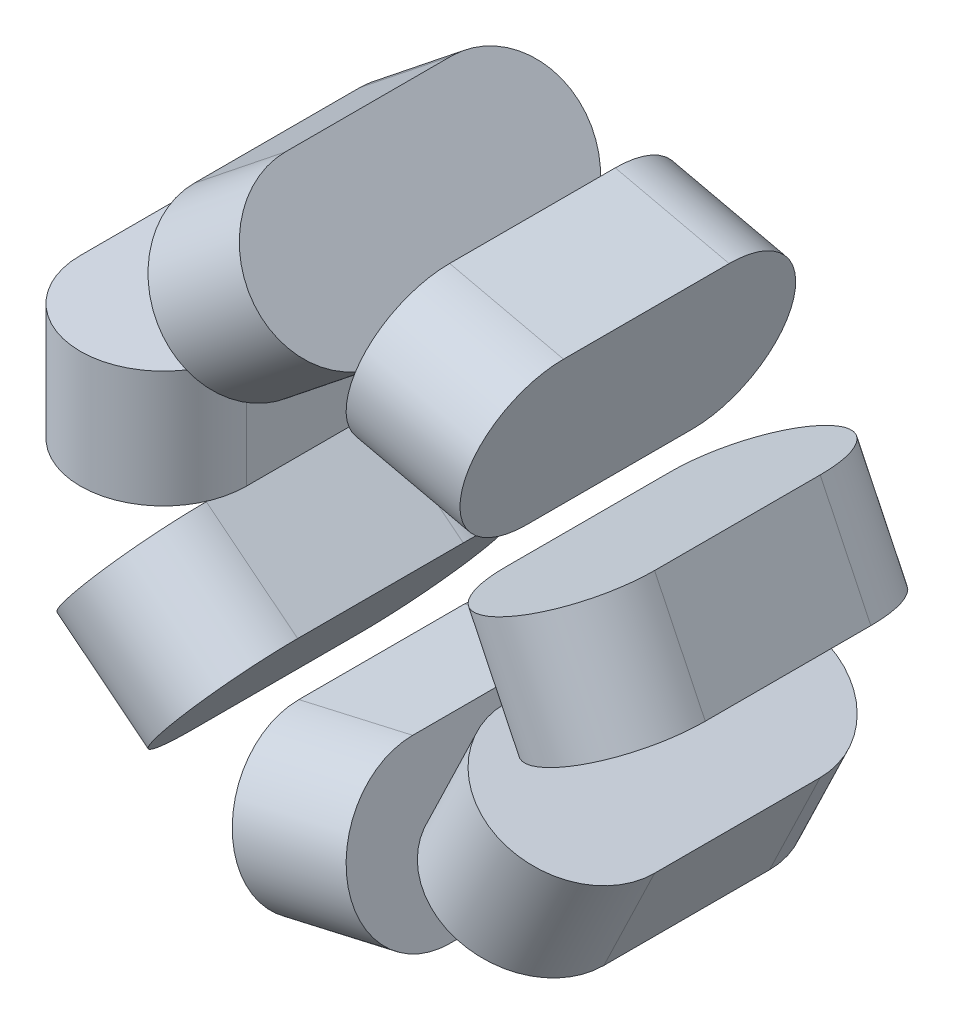
ISO-10303-21;
HEADER;
FILE_DESCRIPTION(('STEP AP214'),'2;1');
FILE_NAME('part.step','',(''),(''),'','','');
FILE_SCHEMA(('AUTOMOTIVE_DESIGN { 1 0 10303 214 1 1 1 1 }'));
ENDSEC;
DATA;
#1=APPLICATION_CONTEXT('core data for automotive mechanical design processes');
#2=APPLICATION_PROTOCOL_DEFINITION('international standard','automotive_design',2000,#1);
#3=PRODUCT_CONTEXT('',#1,'mechanical');
#4=PRODUCT('Part','Part','',(#3));
#5=PRODUCT_RELATED_PRODUCT_CATEGORY('part','',(#4));
#6=PRODUCT_DEFINITION_FORMATION('','',#4);
#7=PRODUCT_DEFINITION_CONTEXT('part definition',#1,'design');
#8=PRODUCT_DEFINITION('design','',#6,#7);
#9=PRODUCT_DEFINITION_SHAPE('','',#8);
#10=(LENGTH_UNIT() NAMED_UNIT(*) SI_UNIT(.MILLI.,.METRE.));
#11=(NAMED_UNIT(*) PLANE_ANGLE_UNIT() SI_UNIT($,.RADIAN.));
#12=(NAMED_UNIT(*) SI_UNIT($,.STERADIAN.) SOLID_ANGLE_UNIT());
#13=UNCERTAINTY_MEASURE_WITH_UNIT(LENGTH_MEASURE(1.E-05),#10,'distance_accuracy_value','');
#14=(GEOMETRIC_REPRESENTATION_CONTEXT(3) GLOBAL_UNCERTAINTY_ASSIGNED_CONTEXT((#13)) GLOBAL_UNIT_ASSIGNED_CONTEXT((#10,
#11,#12)) REPRESENTATION_CONTEXT('',''));
#15=CARTESIAN_POINT('',(0.,0.,0.));
#16=DIRECTION('',(0.,0.,1.));
#17=DIRECTION('',(1.,0.,0.));
#18=AXIS2_PLACEMENT_3D('',#15,#16,#17);
#19=CARTESIAN_POINT('',(503.512842884967,-221.403130222077,852.44114971681));
#20=DIRECTION('',(0.781831482468022,-0.623489801858743,0.));
#21=DIRECTION('',(0.,0.,-1.));
#22=AXIS2_PLACEMENT_3D('',#19,#20,#21);
#23=CYLINDRICAL_SURFACE('',#22,186.757711363559);
#24=CARTESIAN_POINT('',(708.849936114439,-385.15399782305,852.44114971681));
#25=DIRECTION('',(-0.781831482468022,0.623489801858743,0.));
#26=DIRECTION('',(0.,0.,1.));
#27=AXIS2_PLACEMENT_3D('',#24,#25,#26);
#28=CIRCLE('',#27,186.757711363559);
#29=CARTESIAN_POINT('',(825.291464568097,-239.140939485343,852.44114971681));
#30=VERTEX_POINT('',#29);
#31=CARTESIAN_POINT('',(592.408407660781,-531.167056160756,852.44114971681));
#32=VERTEX_POINT('',#31);
#33=EDGE_CURVE('E108',#30,#32,#28,.T.);
#34=ORIENTED_EDGE('',*,*,#33,.T.);
#35=DIRECTION('',(0.781831482468022,-0.623489801858743,0.));
#36=VECTOR('',#35,1.);
#37=CARTESIAN_POINT('',(387.071314431309,-367.416188559783,852.44114971681));
#38=LINE('',#37,#36);
#39=CARTESIAN_POINT('',(387.071314431309,-367.416188559783,852.44114971681));
#40=VERTEX_POINT('',#39);
#41=EDGE_CURVE('E12',#40,#32,#38,.T.);
#42=ORIENTED_EDGE('',*,*,#41,.F.);
#43=CARTESIAN_POINT('',(503.512842884967,-221.403130222077,852.44114971681));
#44=DIRECTION('',(-0.781831482468022,0.623489801858743,0.));
#45=DIRECTION('',(0.,0.,1.));
#46=AXIS2_PLACEMENT_3D('',#43,#44,#45);
#47=CIRCLE('',#46,186.757711363559);
#48=CARTESIAN_POINT('',(619.954371338625,-75.3900718843703,852.44114971681));
#49=VERTEX_POINT('',#48);
#50=EDGE_CURVE('E96',#49,#40,#47,.T.);
#51=ORIENTED_EDGE('',*,*,#50,.F.);
#52=DIRECTION('',(0.781831482468022,-0.623489801858743,0.));
#53=VECTOR('',#52,1.);
#54=CARTESIAN_POINT('',(619.954371338625,-75.3900718843703,852.44114971681));
#55=LINE('',#54,#53);
#56=EDGE_CURVE('E104',#49,#30,#55,.T.);
#57=ORIENTED_EDGE('',*,*,#56,.T.);
#58=EDGE_LOOP('',(#34,#42,#51,#57));
#59=FACE_BOUND('',#58,.T.);
#60=ADVANCED_FACE('F45',(#59),#23,.T.);
#61=CARTESIAN_POINT('',(387.071314431309,-367.416188559783,852.44114971681));
#62=DIRECTION('',(0.623489801858743,0.781831482468022,0.));
#63=DIRECTION('',(0.,0.,-1.));
#64=AXIS2_PLACEMENT_3D('',#61,#62,#63);
#65=PLANE('',#64);
#66=DIRECTION('',(0.,0.,1.));
#67=VECTOR('',#66,1.);
#68=CARTESIAN_POINT('',(592.408407660781,-531.167056160756,852.44114971681));
#69=LINE('',#68,#67);
#70=CARTESIAN_POINT('',(592.408407660781,-531.167056160756,1224.89070806245));
#71=VERTEX_POINT('',#70);
#72=EDGE_CURVE('E100',#32,#71,#69,.T.);
#73=ORIENTED_EDGE('',*,*,#72,.T.);
#74=DIRECTION('',(0.781831482468022,-0.623489801858743,0.));
#75=VECTOR('',#74,1.);
#76=CARTESIAN_POINT('',(387.071314431309,-367.416188559783,1224.89070806245));
#77=LINE('',#76,#75);
#78=CARTESIAN_POINT('',(387.071314431309,-367.416188559783,1224.89070806245));
#79=VERTEX_POINT('',#78);
#80=EDGE_CURVE('E53',#79,#71,#77,.T.);
#81=ORIENTED_EDGE('',*,*,#80,.F.);
#82=DIRECTION('',(0.,0.,1.));
#83=VECTOR('',#82,1.);
#84=CARTESIAN_POINT('',(387.071314431309,-367.416188559783,852.44114971681));
#85=LINE('',#84,#83);
#86=EDGE_CURVE('E91',#40,#79,#85,.T.);
#87=ORIENTED_EDGE('',*,*,#86,.F.);
#88=ORIENTED_EDGE('',*,*,#41,.T.);
#89=EDGE_LOOP('',(#73,#81,#87,#88));
#90=FACE_BOUND('',#89,.T.);
#91=ADVANCED_FACE('F99',(#90),#65,.F.);
#92=CARTESIAN_POINT('',(503.512842884967,-221.403130222077,1224.89070806245));
#93=DIRECTION('',(0.781831482468022,-0.623489801858743,0.));
#94=DIRECTION('',(0.,0.,-1.));
#95=AXIS2_PLACEMENT_3D('',#92,#93,#94);
#96=CYLINDRICAL_SURFACE('',#95,186.757711363559);
#97=CARTESIAN_POINT('',(708.849936114439,-385.15399782305,1224.89070806245));
#98=DIRECTION('',(-0.781831482468022,0.623489801858743,0.));
#99=DIRECTION('',(0.,0.,1.));
#100=AXIS2_PLACEMENT_3D('',#97,#98,#99);
#101=CIRCLE('',#100,186.757711363559);
#102=CARTESIAN_POINT('',(825.291464568097,-239.140939485343,1224.89070806245));
#103=VERTEX_POINT('',#102);
#104=EDGE_CURVE('E78',#71,#103,#101,.T.);
#105=ORIENTED_EDGE('',*,*,#104,.T.);
#106=DIRECTION('',(0.781831482468022,-0.623489801858743,0.));
#107=VECTOR('',#106,1.);
#108=CARTESIAN_POINT('',(619.954371338625,-75.3900718843703,1224.89070806245));
#109=LINE('',#108,#107);
#110=CARTESIAN_POINT('',(619.954371338625,-75.3900718843703,1224.89070806245));
#111=VERTEX_POINT('',#110);
#112=EDGE_CURVE('E101',#111,#103,#109,.T.);
#113=ORIENTED_EDGE('',*,*,#112,.F.);
#114=CARTESIAN_POINT('',(503.512842884967,-221.403130222077,1224.89070806245));
#115=DIRECTION('',(-0.781831482468022,0.623489801858743,0.));
#116=DIRECTION('',(0.,0.,1.));
#117=AXIS2_PLACEMENT_3D('',#114,#115,#116);
#118=CIRCLE('',#117,186.757711363559);
#119=EDGE_CURVE('E94',#79,#111,#118,.T.);
#120=ORIENTED_EDGE('',*,*,#119,.F.);
#121=ORIENTED_EDGE('',*,*,#80,.T.);
#122=EDGE_LOOP('',(#105,#113,#120,#121));
#123=FACE_BOUND('',#122,.T.);
#124=ADVANCED_FACE('F102',(#123),#96,.T.);
#125=CARTESIAN_POINT('',(619.954371338625,-75.3900718843703,852.44114971681));
#126=DIRECTION('',(-0.623489801858743,-0.781831482468022,0.));
#127=DIRECTION('',(0.,0.,1.));
#128=AXIS2_PLACEMENT_3D('',#125,#126,#127);
#129=PLANE('',#128);
#130=DIRECTION('',(0.,0.,-1.));
#131=VECTOR('',#130,1.);
#132=CARTESIAN_POINT('',(825.291464568097,-239.140939485343,852.44114971681));
#133=LINE('',#132,#131);
#134=EDGE_CURVE('E84',#103,#30,#133,.T.);
#135=ORIENTED_EDGE('',*,*,#134,.T.);
#136=ORIENTED_EDGE('',*,*,#56,.F.);
#137=DIRECTION('',(0.,0.,-1.));
#138=VECTOR('',#137,1.);
#139=CARTESIAN_POINT('',(619.954371338625,-75.3900718843703,852.44114971681));
#140=LINE('',#139,#138);
#141=EDGE_CURVE('E61',#111,#49,#140,.T.);
#142=ORIENTED_EDGE('',*,*,#141,.F.);
#143=ORIENTED_EDGE('',*,*,#112,.T.);
#144=EDGE_LOOP('',(#135,#136,#142,#143));
#145=FACE_BOUND('',#144,.T.);
#146=ADVANCED_FACE('F115',(#145),#129,.F.);
#147=CARTESIAN_POINT('',(503.512842884967,-221.403130222077,852.44114971681));
#148=DIRECTION('',(-0.781831482468022,0.623489801858743,0.));
#149=DIRECTION('',(0.,0.,1.));
#150=AXIS2_PLACEMENT_3D('',#147,#148,#149);
#151=PLANE('',#150);
#152=ORIENTED_EDGE('',*,*,#50,.T.);
#153=ORIENTED_EDGE('',*,*,#86,.T.);
#154=ORIENTED_EDGE('',*,*,#119,.T.);
#155=ORIENTED_EDGE('',*,*,#141,.T.);
#156=EDGE_LOOP('',(#152,#153,#154,#155));
#157=FACE_BOUND('',#156,.T.);
#158=ADVANCED_FACE('F92',(#157),#151,.T.);
#159=CARTESIAN_POINT('',(708.849936114439,-385.15399782305,852.44114971681));
#160=DIRECTION('',(-0.781831482468022,0.623489801858743,0.));
#161=DIRECTION('',(0.,0.,1.));
#162=AXIS2_PLACEMENT_3D('',#159,#160,#161);
#163=PLANE('',#162);
#164=ORIENTED_EDGE('',*,*,#33,.F.);
#165=ORIENTED_EDGE('',*,*,#134,.F.);
#166=ORIENTED_EDGE('',*,*,#104,.F.);
#167=ORIENTED_EDGE('',*,*,#72,.F.);
#168=EDGE_LOOP('',(#164,#165,#166,#167));
#169=FACE_BOUND('',#168,.T.);
#170=ADVANCED_FACE('F118',(#169),#163,.F.);
#171=CLOSED_SHELL('',(#60,#91,#124,#146,#158,#170));
#172=MANIFOLD_SOLID_BREP('B2',#171);
#173=CARTESIAN_POINT('',(869.569421479793,-538.721187586139,852.44114971681));
#174=DIRECTION('',(0.974927912181826,0.222520933956305,0.));
#175=DIRECTION('',(0.,0.,-1.));
#176=AXIS2_PLACEMENT_3D('',#173,#174,#175);
#177=CYLINDRICAL_SURFACE('',#176,186.757711363559);
#178=CARTESIAN_POINT('',(1125.62058862358,-480.279179575591,852.44114971681));
#179=DIRECTION('',(-0.974927912181826,-0.222520933956305,0.));
#180=DIRECTION('',(0.,0.,1.));
#181=AXIS2_PLACEMENT_3D('',#178,#179,#180);
#182=CIRCLE('',#181,186.757711363559);
#183=CARTESIAN_POINT('',(1084.06308826742,-298.20387395206,852.44114971681));
#184=VERTEX_POINT('',#183);
#185=CARTESIAN_POINT('',(1167.17808897974,-662.354485199121,852.44114971681));
#186=VERTEX_POINT('',#185);
#187=EDGE_CURVE('E241',#184,#186,#182,.T.);
#188=ORIENTED_EDGE('',*,*,#187,.T.);
#189=DIRECTION('',(0.974927912181826,0.222520933956305,0.));
#190=VECTOR('',#189,1.);
#191=CARTESIAN_POINT('',(911.126921835954,-720.796493209669,852.44114971681));
#192=LINE('',#191,#190);
#193=CARTESIAN_POINT('',(911.126921835954,-720.796493209669,852.44114971681));
#194=VERTEX_POINT('',#193);
#195=EDGE_CURVE('E43',#194,#186,#192,.T.);
#196=ORIENTED_EDGE('',*,*,#195,.F.);
#197=CARTESIAN_POINT('',(869.569421479793,-538.721187586139,852.44114971681));
#198=DIRECTION('',(-0.974927912181826,-0.222520933956305,0.));
#199=DIRECTION('',(0.,0.,1.));
#200=AXIS2_PLACEMENT_3D('',#197,#198,#199);
#201=CIRCLE('',#200,186.757711363559);
#202=CARTESIAN_POINT('',(828.011921123631,-356.645881962608,852.44114971681));
#203=VERTEX_POINT('',#202);
#204=EDGE_CURVE('E229',#203,#194,#201,.T.);
#205=ORIENTED_EDGE('',*,*,#204,.F.);
#206=DIRECTION('',(0.974927912181826,0.222520933956305,0.));
#207=VECTOR('',#206,1.);
#208=CARTESIAN_POINT('',(828.011921123631,-356.645881962608,852.44114971681));
#209=LINE('',#208,#207);
#210=EDGE_CURVE('E237',#203,#184,#209,.T.);
#211=ORIENTED_EDGE('',*,*,#210,.T.);
#212=EDGE_LOOP('',(#188,#196,#205,#211));
#213=FACE_BOUND('',#212,.T.);
#214=ADVANCED_FACE('F178',(#213),#177,.T.);
#215=CARTESIAN_POINT('',(911.126921835954,-720.796493209669,852.44114971681));
#216=DIRECTION('',(-0.222520933956305,0.974927912181826,0.));
#217=DIRECTION('',(0.,0.,-1.));
#218=AXIS2_PLACEMENT_3D('',#215,#216,#217);
#219=PLANE('',#218);
#220=DIRECTION('',(0.,0.,1.));
#221=VECTOR('',#220,1.);
#222=CARTESIAN_POINT('',(1167.17808897974,-662.354485199121,852.44114971681));
#223=LINE('',#222,#221);
#224=CARTESIAN_POINT('',(1167.17808897974,-662.354485199121,1224.89070806245));
#225=VERTEX_POINT('',#224);
#226=EDGE_CURVE('E233',#186,#225,#223,.T.);
#227=ORIENTED_EDGE('',*,*,#226,.T.);
#228=DIRECTION('',(0.974927912181826,0.222520933956305,0.));
#229=VECTOR('',#228,1.);
#230=CARTESIAN_POINT('',(911.126921835954,-720.796493209669,1224.89070806245));
#231=LINE('',#230,#229);
#232=CARTESIAN_POINT('',(911.126921835954,-720.796493209669,1224.89070806245));
#233=VERTEX_POINT('',#232);
#234=EDGE_CURVE('E186',#233,#225,#231,.T.);
#235=ORIENTED_EDGE('',*,*,#234,.F.);
#236=DIRECTION('',(0.,0.,1.));
#237=VECTOR('',#236,1.);
#238=CARTESIAN_POINT('',(911.126921835954,-720.796493209669,852.44114971681));
#239=LINE('',#238,#237);
#240=EDGE_CURVE('E224',#194,#233,#239,.T.);
#241=ORIENTED_EDGE('',*,*,#240,.F.);
#242=ORIENTED_EDGE('',*,*,#195,.T.);
#243=EDGE_LOOP('',(#227,#235,#241,#242));
#244=FACE_BOUND('',#243,.T.);
#245=ADVANCED_FACE('F232',(#244),#219,.F.);
#246=CARTESIAN_POINT('',(869.569421479793,-538.721187586139,1224.89070806245));
#247=DIRECTION('',(0.974927912181826,0.222520933956305,0.));
#248=DIRECTION('',(0.,0.,-1.));
#249=AXIS2_PLACEMENT_3D('',#246,#247,#248);
#250=CYLINDRICAL_SURFACE('',#249,186.757711363559);
#251=CARTESIAN_POINT('',(1125.62058862358,-480.279179575591,1224.89070806245));
#252=DIRECTION('',(-0.974927912181826,-0.222520933956305,0.));
#253=DIRECTION('',(0.,0.,1.));
#254=AXIS2_PLACEMENT_3D('',#251,#252,#253);
#255=CIRCLE('',#254,186.757711363559);
#256=CARTESIAN_POINT('',(1084.06308826742,-298.20387395206,1224.89070806245));
#257=VERTEX_POINT('',#256);
#258=EDGE_CURVE('E211',#225,#257,#255,.T.);
#259=ORIENTED_EDGE('',*,*,#258,.T.);
#260=DIRECTION('',(0.974927912181826,0.222520933956305,0.));
#261=VECTOR('',#260,1.);
#262=CARTESIAN_POINT('',(828.011921123631,-356.645881962608,1224.89070806245));
#263=LINE('',#262,#261);
#264=CARTESIAN_POINT('',(828.011921123631,-356.645881962608,1224.89070806245));
#265=VERTEX_POINT('',#264);
#266=EDGE_CURVE('E234',#265,#257,#263,.T.);
#267=ORIENTED_EDGE('',*,*,#266,.F.);
#268=CARTESIAN_POINT('',(869.569421479793,-538.721187586139,1224.89070806245));
#269=DIRECTION('',(-0.974927912181826,-0.222520933956305,0.));
#270=DIRECTION('',(0.,0.,1.));
#271=AXIS2_PLACEMENT_3D('',#268,#269,#270);
#272=CIRCLE('',#271,186.757711363559);
#273=EDGE_CURVE('E227',#233,#265,#272,.T.);
#274=ORIENTED_EDGE('',*,*,#273,.F.);
#275=ORIENTED_EDGE('',*,*,#234,.T.);
#276=EDGE_LOOP('',(#259,#267,#274,#275));
#277=FACE_BOUND('',#276,.T.);
#278=ADVANCED_FACE('F235',(#277),#250,.T.);
#279=CARTESIAN_POINT('',(828.011921123631,-356.645881962608,852.44114971681));
#280=DIRECTION('',(0.222520933956305,-0.974927912181826,0.));
#281=DIRECTION('',(0.,0.,1.));
#282=AXIS2_PLACEMENT_3D('',#279,#280,#281);
#283=PLANE('',#282);
#284=DIRECTION('',(0.,0.,-1.));
#285=VECTOR('',#284,1.);
#286=CARTESIAN_POINT('',(1084.06308826742,-298.20387395206,852.44114971681));
#287=LINE('',#286,#285);
#288=EDGE_CURVE('E217',#257,#184,#287,.T.);
#289=ORIENTED_EDGE('',*,*,#288,.T.);
#290=ORIENTED_EDGE('',*,*,#210,.F.);
#291=DIRECTION('',(0.,0.,-1.));
#292=VECTOR('',#291,1.);
#293=CARTESIAN_POINT('',(828.011921123631,-356.645881962608,852.44114971681));
#294=LINE('',#293,#292);
#295=EDGE_CURVE('E194',#265,#203,#294,.T.);
#296=ORIENTED_EDGE('',*,*,#295,.F.);
#297=ORIENTED_EDGE('',*,*,#266,.T.);
#298=EDGE_LOOP('',(#289,#290,#296,#297));
#299=FACE_BOUND('',#298,.T.);
#300=ADVANCED_FACE('F248',(#299),#283,.F.);
#301=CARTESIAN_POINT('',(869.569421479793,-538.721187586139,852.44114971681));
#302=DIRECTION('',(-0.974927912181826,-0.222520933956305,0.));
#303=DIRECTION('',(0.,0.,1.));
#304=AXIS2_PLACEMENT_3D('',#301,#302,#303);
#305=PLANE('',#304);
#306=ORIENTED_EDGE('',*,*,#204,.T.);
#307=ORIENTED_EDGE('',*,*,#240,.T.);
#308=ORIENTED_EDGE('',*,*,#273,.T.);
#309=ORIENTED_EDGE('',*,*,#295,.T.);
#310=EDGE_LOOP('',(#306,#307,#308,#309));
#311=FACE_BOUND('',#310,.T.);
#312=ADVANCED_FACE('F225',(#311),#305,.T.);
#313=CARTESIAN_POINT('',(1125.62058862358,-480.279179575591,852.44114971681));
#314=DIRECTION('',(-0.974927912181826,-0.222520933956305,0.));
#315=DIRECTION('',(0.,0.,1.));
#316=AXIS2_PLACEMENT_3D('',#313,#314,#315);
#317=PLANE('',#316);
#318=ORIENTED_EDGE('',*,*,#187,.F.);
#319=ORIENTED_EDGE('',*,*,#288,.F.);
#320=ORIENTED_EDGE('',*,*,#258,.F.);
#321=ORIENTED_EDGE('',*,*,#226,.F.);
#322=EDGE_LOOP('',(#318,#319,#320,#321));
#323=FACE_BOUND('',#322,.T.);
#324=ADVANCED_FACE('F251',(#323),#317,.F.);
#325=CLOSED_SHELL('',(#214,#245,#278,#300,#312,#324));
#326=MANIFOLD_SOLID_BREP('B6',#325);
#327=CARTESIAN_POINT('',(1345.89121233979,-450.371202788288,852.44114971681));
#328=DIRECTION('',(0.433883739117565,0.900968867902416,0.));
#329=DIRECTION('',(0.,0.,-1.));
#330=AXIS2_PLACEMENT_3D('',#327,#328,#329);
#331=CYLINDRICAL_SURFACE('',#330,186.757711363559);
#332=CARTESIAN_POINT('',(1459.84470204667,-213.744343197869,852.44114971681));
#333=DIRECTION('',(-0.433883739117565,-0.900968867902416,0.));
#334=DIRECTION('',(0.,0.,1.));
#335=AXIS2_PLACEMENT_3D('',#332,#333,#334);
#336=CIRCLE('',#335,186.757711363559);
#337=CARTESIAN_POINT('',(1291.58181826739,-132.713209082409,852.44114971681));
#338=VERTEX_POINT('',#337);
#339=CARTESIAN_POINT('',(1628.10758582594,-294.775477313329,852.44114971681));
#340=VERTEX_POINT('',#339);
#341=EDGE_CURVE('E374',#338,#340,#336,.T.);
#342=ORIENTED_EDGE('',*,*,#341,.T.);
#343=DIRECTION('',(0.433883739117565,0.900968867902416,0.));
#344=VECTOR('',#343,1.);
#345=CARTESIAN_POINT('',(1514.15409611906,-531.402336903748,852.44114971681));
#346=LINE('',#345,#344);
#347=CARTESIAN_POINT('',(1514.15409611906,-531.402336903748,852.44114971681));
#348=VERTEX_POINT('',#347);
#349=EDGE_CURVE('E176',#348,#340,#346,.T.);
#350=ORIENTED_EDGE('',*,*,#349,.F.);
#351=CARTESIAN_POINT('',(1345.89121233979,-450.371202788288,852.44114971681));
#352=DIRECTION('',(-0.433883739117565,-0.900968867902416,0.));
#353=DIRECTION('',(0.,0.,1.));
#354=AXIS2_PLACEMENT_3D('',#351,#352,#353);
#355=CIRCLE('',#354,186.757711363559);
#356=CARTESIAN_POINT('',(1177.62832856051,-369.340068672828,852.44114971681));
#357=VERTEX_POINT('',#356);
#358=EDGE_CURVE('E362',#357,#348,#355,.T.);
#359=ORIENTED_EDGE('',*,*,#358,.F.);
#360=DIRECTION('',(0.433883739117565,0.900968867902416,0.));
#361=VECTOR('',#360,1.);
#362=CARTESIAN_POINT('',(1177.62832856051,-369.340068672828,852.44114971681));
#363=LINE('',#362,#361);
#364=EDGE_CURVE('E370',#357,#338,#363,.T.);
#365=ORIENTED_EDGE('',*,*,#364,.T.);
#366=EDGE_LOOP('',(#342,#350,#359,#365));
#367=FACE_BOUND('',#366,.T.);
#368=ADVANCED_FACE('F311',(#367),#331,.T.);
#369=CARTESIAN_POINT('',(1514.15409611906,-531.402336903748,852.44114971681));
#370=DIRECTION('',(-0.900968867902416,0.433883739117565,0.));
#371=DIRECTION('',(0.,0.,-1.));
#372=AXIS2_PLACEMENT_3D('',#369,#370,#371);
#373=PLANE('',#372);
#374=DIRECTION('',(0.,0.,1.));
#375=VECTOR('',#374,1.);
#376=CARTESIAN_POINT('',(1628.10758582594,-294.775477313329,852.44114971681));
#377=LINE('',#376,#375);
#378=CARTESIAN_POINT('',(1628.10758582594,-294.775477313329,1224.89070806245));
#379=VERTEX_POINT('',#378);
#380=EDGE_CURVE('E366',#340,#379,#377,.T.);
#381=ORIENTED_EDGE('',*,*,#380,.T.);
#382=DIRECTION('',(0.433883739117565,0.900968867902416,0.));
#383=VECTOR('',#382,1.);
#384=CARTESIAN_POINT('',(1514.15409611906,-531.402336903748,1224.89070806245));
#385=LINE('',#384,#383);
#386=CARTESIAN_POINT('',(1514.15409611906,-531.402336903748,1224.89070806245));
#387=VERTEX_POINT('',#386);
#388=EDGE_CURVE('E319',#387,#379,#385,.T.);
#389=ORIENTED_EDGE('',*,*,#388,.F.);
#390=DIRECTION('',(0.,0.,1.));
#391=VECTOR('',#390,1.);
#392=CARTESIAN_POINT('',(1514.15409611906,-531.402336903748,852.44114971681));
#393=LINE('',#392,#391);
#394=EDGE_CURVE('E357',#348,#387,#393,.T.);
#395=ORIENTED_EDGE('',*,*,#394,.F.);
#396=ORIENTED_EDGE('',*,*,#349,.T.);
#397=EDGE_LOOP('',(#381,#389,#395,#396));
#398=FACE_BOUND('',#397,.T.);
#399=ADVANCED_FACE('F365',(#398),#373,.F.);
#400=CARTESIAN_POINT('',(1345.89121233979,-450.371202788288,1224.89070806245));
#401=DIRECTION('',(0.433883739117565,0.900968867902416,0.));
#402=DIRECTION('',(0.,0.,-1.));
#403=AXIS2_PLACEMENT_3D('',#400,#401,#402);
#404=CYLINDRICAL_SURFACE('',#403,186.757711363559);
#405=CARTESIAN_POINT('',(1459.84470204667,-213.744343197869,1224.89070806245));
#406=DIRECTION('',(-0.433883739117565,-0.900968867902416,0.));
#407=DIRECTION('',(0.,0.,1.));
#408=AXIS2_PLACEMENT_3D('',#405,#406,#407);
#409=CIRCLE('',#408,186.757711363559);
#410=CARTESIAN_POINT('',(1291.58181826739,-132.713209082409,1224.89070806245));
#411=VERTEX_POINT('',#410);
#412=EDGE_CURVE('E344',#379,#411,#409,.T.);
#413=ORIENTED_EDGE('',*,*,#412,.T.);
#414=DIRECTION('',(0.433883739117565,0.900968867902416,0.));
#415=VECTOR('',#414,1.);
#416=CARTESIAN_POINT('',(1177.62832856051,-369.340068672828,1224.89070806245));
#417=LINE('',#416,#415);
#418=CARTESIAN_POINT('',(1177.62832856051,-369.340068672828,1224.89070806245));
#419=VERTEX_POINT('',#418);
#420=EDGE_CURVE('E367',#419,#411,#417,.T.);
#421=ORIENTED_EDGE('',*,*,#420,.F.);
#422=CARTESIAN_POINT('',(1345.89121233979,-450.371202788288,1224.89070806245));
#423=DIRECTION('',(-0.433883739117565,-0.900968867902416,0.));
#424=DIRECTION('',(0.,0.,1.));
#425=AXIS2_PLACEMENT_3D('',#422,#423,#424);
#426=CIRCLE('',#425,186.757711363559);
#427=EDGE_CURVE('E360',#387,#419,#426,.T.);
#428=ORIENTED_EDGE('',*,*,#427,.F.);
#429=ORIENTED_EDGE('',*,*,#388,.T.);
#430=EDGE_LOOP('',(#413,#421,#428,#429));
#431=FACE_BOUND('',#430,.T.);
#432=ADVANCED_FACE('F368',(#431),#404,.T.);
#433=CARTESIAN_POINT('',(1177.62832856051,-369.340068672828,852.44114971681));
#434=DIRECTION('',(0.900968867902416,-0.433883739117565,0.));
#435=DIRECTION('',(0.,0.,1.));
#436=AXIS2_PLACEMENT_3D('',#433,#434,#435);
#437=PLANE('',#436);
#438=DIRECTION('',(0.,0.,-1.));
#439=VECTOR('',#438,1.);
#440=CARTESIAN_POINT('',(1291.58181826739,-132.713209082409,852.44114971681));
#441=LINE('',#440,#439);
#442=EDGE_CURVE('E350',#411,#338,#441,.T.);
#443=ORIENTED_EDGE('',*,*,#442,.T.);
#444=ORIENTED_EDGE('',*,*,#364,.F.);
#445=DIRECTION('',(0.,0.,-1.));
#446=VECTOR('',#445,1.);
#447=CARTESIAN_POINT('',(1177.62832856051,-369.340068672828,852.44114971681));
#448=LINE('',#447,#446);
#449=EDGE_CURVE('E327',#419,#357,#448,.T.);
#450=ORIENTED_EDGE('',*,*,#449,.F.);
#451=ORIENTED_EDGE('',*,*,#420,.T.);
#452=EDGE_LOOP('',(#443,#444,#450,#451));
#453=FACE_BOUND('',#452,.T.);
#454=ADVANCED_FACE('F381',(#453),#437,.F.);
#455=CARTESIAN_POINT('',(1345.89121233979,-450.371202788288,852.44114971681));
#456=DIRECTION('',(-0.433883739117565,-0.900968867902416,0.));
#457=DIRECTION('',(0.,0.,1.));
#458=AXIS2_PLACEMENT_3D('',#455,#456,#457);
#459=PLANE('',#458);
#460=ORIENTED_EDGE('',*,*,#358,.T.);
#461=ORIENTED_EDGE('',*,*,#394,.T.);
#462=ORIENTED_EDGE('',*,*,#427,.T.);
#463=ORIENTED_EDGE('',*,*,#449,.T.);
#464=EDGE_LOOP('',(#460,#461,#462,#463));
#465=FACE_BOUND('',#464,.T.);
#466=ADVANCED_FACE('F358',(#465),#459,.T.);
#467=CARTESIAN_POINT('',(1459.84470204667,-213.744343197869,852.44114971681));
#468=DIRECTION('',(-0.433883739117565,-0.900968867902416,0.));
#469=DIRECTION('',(0.,0.,1.));
#470=AXIS2_PLACEMENT_3D('',#467,#468,#469);
#471=PLANE('',#470);
#472=ORIENTED_EDGE('',*,*,#341,.F.);
#473=ORIENTED_EDGE('',*,*,#442,.F.);
#474=ORIENTED_EDGE('',*,*,#412,.F.);
#475=ORIENTED_EDGE('',*,*,#380,.F.);
#476=EDGE_LOOP('',(#472,#473,#474,#475));
#477=FACE_BOUND('',#476,.T.);
#478=ADVANCED_FACE('F384',(#477),#471,.F.);
#479=CLOSED_SHELL('',(#368,#399,#432,#454,#466,#478));
#480=MANIFOLD_SOLID_BREP('B37',#479);
#481=CARTESIAN_POINT('',(1573.79819175355,-22.8825163925579,852.44114971681));
#482=DIRECTION('',(-0.433883739117553,0.900968867902422,0.));
#483=DIRECTION('',(0.,0.,-1.));
#484=AXIS2_PLACEMENT_3D('',#481,#482,#483);
#485=CYLINDRICAL_SURFACE('',#484,186.757711363559);
#486=CARTESIAN_POINT('',(1459.84470204667,213.744343197863,852.44114971681));
#487=DIRECTION('',(0.433883739117553,-0.900968867902422,0.));
#488=DIRECTION('',(0.,0.,1.));
#489=AXIS2_PLACEMENT_3D('',#486,#487,#488);
#490=CIRCLE('',#489,186.757711363559);
#491=CARTESIAN_POINT('',(1291.5818182674,132.713209082405,852.44114971681));
#492=VERTEX_POINT('',#491);
#493=CARTESIAN_POINT('',(1628.10758582594,294.77547731332,852.44114971681));
#494=VERTEX_POINT('',#493);
#495=EDGE_CURVE('E507',#492,#494,#490,.T.);
#496=ORIENTED_EDGE('',*,*,#495,.T.);
#497=DIRECTION('',(-0.433883739117553,0.900968867902422,0.));
#498=VECTOR('',#497,1.);
#499=CARTESIAN_POINT('',(1742.06107553282,58.1486177228998,852.44114971681));
#500=LINE('',#499,#498);
#501=CARTESIAN_POINT('',(1742.06107553282,58.1486177228998,852.44114971681));
#502=VERTEX_POINT('',#501);
#503=EDGE_CURVE('E309',#502,#494,#500,.T.);
#504=ORIENTED_EDGE('',*,*,#503,.F.);
#505=CARTESIAN_POINT('',(1573.79819175355,-22.8825163925579,852.44114971681));
#506=DIRECTION('',(0.433883739117553,-0.900968867902422,0.));
#507=DIRECTION('',(0.,0.,1.));
#508=AXIS2_PLACEMENT_3D('',#505,#506,#507);
#509=CIRCLE('',#508,186.757711363559);
#510=CARTESIAN_POINT('',(1405.53530797427,-103.913650508016,852.44114971681));
#511=VERTEX_POINT('',#510);
#512=EDGE_CURVE('E495',#511,#502,#509,.T.);
#513=ORIENTED_EDGE('',*,*,#512,.F.);
#514=DIRECTION('',(-0.433883739117553,0.900968867902422,0.));
#515=VECTOR('',#514,1.);
#516=CARTESIAN_POINT('',(1405.53530797427,-103.913650508016,852.44114971681));
#517=LINE('',#516,#515);
#518=EDGE_CURVE('E503',#511,#492,#517,.T.);
#519=ORIENTED_EDGE('',*,*,#518,.T.);
#520=EDGE_LOOP('',(#496,#504,#513,#519));
#521=FACE_BOUND('',#520,.T.);
#522=ADVANCED_FACE('F444',(#521),#485,.T.);
#523=CARTESIAN_POINT('',(1742.06107553282,58.1486177228998,852.44114971681));
#524=DIRECTION('',(-0.900968867902422,-0.433883739117553,0.));
#525=DIRECTION('',(0.,0.,-1.));
#526=AXIS2_PLACEMENT_3D('',#523,#524,#525);
#527=PLANE('',#526);
#528=DIRECTION('',(0.,0.,1.));
#529=VECTOR('',#528,1.);
#530=CARTESIAN_POINT('',(1628.10758582594,294.77547731332,852.44114971681));
#531=LINE('',#530,#529);
#532=CARTESIAN_POINT('',(1628.10758582594,294.77547731332,1224.89070806245));
#533=VERTEX_POINT('',#532);
#534=EDGE_CURVE('E499',#494,#533,#531,.T.);
#535=ORIENTED_EDGE('',*,*,#534,.T.);
#536=DIRECTION('',(-0.433883739117553,0.900968867902422,0.));
#537=VECTOR('',#536,1.);
#538=CARTESIAN_POINT('',(1742.06107553282,58.1486177228997,1224.89070806245));
#539=LINE('',#538,#537);
#540=CARTESIAN_POINT('',(1742.06107553282,58.1486177228997,1224.89070806245));
#541=VERTEX_POINT('',#540);
#542=EDGE_CURVE('E452',#541,#533,#539,.T.);
#543=ORIENTED_EDGE('',*,*,#542,.F.);
#544=DIRECTION('',(0.,0.,1.));
#545=VECTOR('',#544,1.);
#546=CARTESIAN_POINT('',(1742.06107553282,58.1486177228998,852.44114971681));
#547=LINE('',#546,#545);
#548=EDGE_CURVE('E490',#502,#541,#547,.T.);
#549=ORIENTED_EDGE('',*,*,#548,.F.);
#550=ORIENTED_EDGE('',*,*,#503,.T.);
#551=EDGE_LOOP('',(#535,#543,#549,#550));
#552=FACE_BOUND('',#551,.T.);
#553=ADVANCED_FACE('F498',(#552),#527,.F.);
#554=CARTESIAN_POINT('',(1573.79819175355,-22.8825163925579,1224.89070806245));
#555=DIRECTION('',(-0.433883739117553,0.900968867902422,0.));
#556=DIRECTION('',(0.,0.,-1.));
#557=AXIS2_PLACEMENT_3D('',#554,#555,#556);
#558=CYLINDRICAL_SURFACE('',#557,186.757711363559);
#559=CARTESIAN_POINT('',(1459.84470204667,213.744343197863,1224.89070806245));
#560=DIRECTION('',(0.433883739117553,-0.900968867902422,0.));
#561=DIRECTION('',(0.,0.,1.));
#562=AXIS2_PLACEMENT_3D('',#559,#560,#561);
#563=CIRCLE('',#562,186.757711363559);
#564=CARTESIAN_POINT('',(1291.5818182674,132.713209082405,1224.89070806245));
#565=VERTEX_POINT('',#564);
#566=EDGE_CURVE('E477',#533,#565,#563,.T.);
#567=ORIENTED_EDGE('',*,*,#566,.T.);
#568=DIRECTION('',(-0.433883739117553,0.900968867902422,0.));
#569=VECTOR('',#568,1.);
#570=CARTESIAN_POINT('',(1405.53530797427,-103.913650508016,1224.89070806245));
#571=LINE('',#570,#569);
#572=CARTESIAN_POINT('',(1405.53530797427,-103.913650508016,1224.89070806245));
#573=VERTEX_POINT('',#572);
#574=EDGE_CURVE('E500',#573,#565,#571,.T.);
#575=ORIENTED_EDGE('',*,*,#574,.F.);
#576=CARTESIAN_POINT('',(1573.79819175355,-22.8825163925579,1224.89070806245));
#577=DIRECTION('',(0.433883739117553,-0.900968867902422,0.));
#578=DIRECTION('',(0.,0.,1.));
#579=AXIS2_PLACEMENT_3D('',#576,#577,#578);
#580=CIRCLE('',#579,186.757711363559);
#581=EDGE_CURVE('E493',#541,#573,#580,.T.);
#582=ORIENTED_EDGE('',*,*,#581,.F.);
#583=ORIENTED_EDGE('',*,*,#542,.T.);
#584=EDGE_LOOP('',(#567,#575,#582,#583));
#585=FACE_BOUND('',#584,.T.);
#586=ADVANCED_FACE('F501',(#585),#558,.T.);
#587=CARTESIAN_POINT('',(1405.53530797427,-103.913650508016,852.44114971681));
#588=DIRECTION('',(0.900968867902422,0.433883739117553,0.));
#589=DIRECTION('',(0.,0.,1.));
#590=AXIS2_PLACEMENT_3D('',#587,#588,#589);
#591=PLANE('',#590);
#592=DIRECTION('',(0.,0.,-1.));
#593=VECTOR('',#592,1.);
#594=CARTESIAN_POINT('',(1291.5818182674,132.713209082405,852.44114971681));
#595=LINE('',#594,#593);
#596=EDGE_CURVE('E483',#565,#492,#595,.T.);
#597=ORIENTED_EDGE('',*,*,#596,.T.);
#598=ORIENTED_EDGE('',*,*,#518,.F.);
#599=DIRECTION('',(0.,0.,-1.));
#600=VECTOR('',#599,1.);
#601=CARTESIAN_POINT('',(1405.53530797427,-103.913650508016,852.44114971681));
#602=LINE('',#601,#600);
#603=EDGE_CURVE('E460',#573,#511,#602,.T.);
#604=ORIENTED_EDGE('',*,*,#603,.F.);
#605=ORIENTED_EDGE('',*,*,#574,.T.);
#606=EDGE_LOOP('',(#597,#598,#604,#605));
#607=FACE_BOUND('',#606,.T.);
#608=ADVANCED_FACE('F514',(#607),#591,.F.);
#609=CARTESIAN_POINT('',(1573.79819175355,-22.8825163925579,852.44114971681));
#610=DIRECTION('',(0.433883739117553,-0.900968867902422,0.));
#611=DIRECTION('',(0.,0.,1.));
#612=AXIS2_PLACEMENT_3D('',#609,#610,#611);
#613=PLANE('',#612);
#614=ORIENTED_EDGE('',*,*,#512,.T.);
#615=ORIENTED_EDGE('',*,*,#548,.T.);
#616=ORIENTED_EDGE('',*,*,#581,.T.);
#617=ORIENTED_EDGE('',*,*,#603,.T.);
#618=EDGE_LOOP('',(#614,#615,#616,#617));
#619=FACE_BOUND('',#618,.T.);
#620=ADVANCED_FACE('F491',(#619),#613,.T.);
#621=CARTESIAN_POINT('',(1459.84470204667,213.744343197863,852.44114971681));
#622=DIRECTION('',(0.433883739117553,-0.900968867902422,0.));
#623=DIRECTION('',(0.,0.,1.));
#624=AXIS2_PLACEMENT_3D('',#621,#622,#623);
#625=PLANE('',#624);
#626=ORIENTED_EDGE('',*,*,#495,.F.);
#627=ORIENTED_EDGE('',*,*,#596,.F.);
#628=ORIENTED_EDGE('',*,*,#566,.F.);
#629=ORIENTED_EDGE('',*,*,#534,.F.);
#630=EDGE_LOOP('',(#626,#627,#628,#629));
#631=FACE_BOUND('',#630,.T.);
#632=ADVANCED_FACE('F517',(#631),#625,.F.);
#633=CLOSED_SHELL('',(#522,#553,#586,#608,#620,#632));
#634=MANIFOLD_SOLID_BREP('B170',#633);
#635=CARTESIAN_POINT('',(1381.67175576737,421.837171565038,852.44114971681));
#636=DIRECTION('',(-0.974927912181823,0.222520933956318,0.));
#637=DIRECTION('',(0.,0.,-1.));
#638=AXIS2_PLACEMENT_3D('',#635,#636,#637);
#639=CYLINDRICAL_SURFACE('',#638,186.757711363559);
#640=CARTESIAN_POINT('',(1125.62058862359,480.279179575589,852.44114971681));
#641=DIRECTION('',(0.974927912181823,-0.222520933956318,0.));
#642=DIRECTION('',(0.,0.,1.));
#643=AXIS2_PLACEMENT_3D('',#640,#641,#642);
#644=CIRCLE('',#643,186.757711363559);
#645=CARTESIAN_POINT('',(1084.06308826742,298.203873952059,852.44114971681));
#646=VERTEX_POINT('',#645);
#647=CARTESIAN_POINT('',(1167.17808897975,662.354485199119,852.44114971681));
#648=VERTEX_POINT('',#647);
#649=EDGE_CURVE('E640',#646,#648,#644,.T.);
#650=ORIENTED_EDGE('',*,*,#649,.T.);
#651=DIRECTION('',(-0.974927912181823,0.222520933956318,0.));
#652=VECTOR('',#651,1.);
#653=CARTESIAN_POINT('',(1423.22925612353,603.912477188568,852.44114971681));
#654=LINE('',#653,#652);
#655=CARTESIAN_POINT('',(1423.22925612353,603.912477188568,852.44114971681));
#656=VERTEX_POINT('',#655);
#657=EDGE_CURVE('E442',#656,#648,#654,.T.);
#658=ORIENTED_EDGE('',*,*,#657,.F.);
#659=CARTESIAN_POINT('',(1381.67175576737,421.837171565038,852.44114971681));
#660=DIRECTION('',(0.974927912181823,-0.222520933956318,0.));
#661=DIRECTION('',(0.,0.,1.));
#662=AXIS2_PLACEMENT_3D('',#659,#660,#661);
#663=CIRCLE('',#662,186.757711363559);
#664=CARTESIAN_POINT('',(1340.11425541121,239.761865941507,852.44114971681));
#665=VERTEX_POINT('',#664);
#666=EDGE_CURVE('E628',#665,#656,#663,.T.);
#667=ORIENTED_EDGE('',*,*,#666,.F.);
#668=DIRECTION('',(-0.974927912181823,0.222520933956318,0.));
#669=VECTOR('',#668,1.);
#670=CARTESIAN_POINT('',(1340.11425541121,239.761865941507,852.44114971681));
#671=LINE('',#670,#669);
#672=EDGE_CURVE('E636',#665,#646,#671,.T.);
#673=ORIENTED_EDGE('',*,*,#672,.T.);
#674=EDGE_LOOP('',(#650,#658,#667,#673));
#675=FACE_BOUND('',#674,.T.);
#676=ADVANCED_FACE('F577',(#675),#639,.T.);
#677=CARTESIAN_POINT('',(1423.22925612353,603.912477188568,852.44114971681));
#678=DIRECTION('',(-0.222520933956318,-0.974927912181823,0.));
#679=DIRECTION('',(0.,0.,-1.));
#680=AXIS2_PLACEMENT_3D('',#677,#678,#679);
#681=PLANE('',#680);
#682=DIRECTION('',(0.,0.,1.));
#683=VECTOR('',#682,1.);
#684=CARTESIAN_POINT('',(1167.17808897975,662.354485199119,852.44114971681));
#685=LINE('',#684,#683);
#686=CARTESIAN_POINT('',(1167.17808897975,662.354485199119,1224.89070806245));
#687=VERTEX_POINT('',#686);
#688=EDGE_CURVE('E632',#648,#687,#685,.T.);
#689=ORIENTED_EDGE('',*,*,#688,.T.);
#690=DIRECTION('',(-0.974927912181823,0.222520933956318,0.));
#691=VECTOR('',#690,1.);
#692=CARTESIAN_POINT('',(1423.22925612353,603.912477188568,1224.89070806245));
#693=LINE('',#692,#691);
#694=CARTESIAN_POINT('',(1423.22925612353,603.912477188568,1224.89070806245));
#695=VERTEX_POINT('',#694);
#696=EDGE_CURVE('E585',#695,#687,#693,.T.);
#697=ORIENTED_EDGE('',*,*,#696,.F.);
#698=DIRECTION('',(0.,0.,1.));
#699=VECTOR('',#698,1.);
#700=CARTESIAN_POINT('',(1423.22925612353,603.912477188568,852.44114971681));
#701=LINE('',#700,#699);
#702=EDGE_CURVE('E623',#656,#695,#701,.T.);
#703=ORIENTED_EDGE('',*,*,#702,.F.);
#704=ORIENTED_EDGE('',*,*,#657,.T.);
#705=EDGE_LOOP('',(#689,#697,#703,#704));
#706=FACE_BOUND('',#705,.T.);
#707=ADVANCED_FACE('F631',(#706),#681,.F.);
#708=CARTESIAN_POINT('',(1381.67175576737,421.837171565038,1224.89070806245));
#709=DIRECTION('',(-0.974927912181823,0.222520933956318,0.));
#710=DIRECTION('',(0.,0.,-1.));
#711=AXIS2_PLACEMENT_3D('',#708,#709,#710);
#712=CYLINDRICAL_SURFACE('',#711,186.757711363559);
#713=CARTESIAN_POINT('',(1125.62058862359,480.279179575589,1224.89070806245));
#714=DIRECTION('',(0.974927912181823,-0.222520933956318,0.));
#715=DIRECTION('',(0.,0.,1.));
#716=AXIS2_PLACEMENT_3D('',#713,#714,#715);
#717=CIRCLE('',#716,186.757711363559);
#718=CARTESIAN_POINT('',(1084.06308826742,298.203873952059,1224.89070806245));
#719=VERTEX_POINT('',#718);
#720=EDGE_CURVE('E610',#687,#719,#717,.T.);
#721=ORIENTED_EDGE('',*,*,#720,.T.);
#722=DIRECTION('',(-0.974927912181823,0.222520933956318,0.));
#723=VECTOR('',#722,1.);
#724=CARTESIAN_POINT('',(1340.11425541121,239.761865941507,1224.89070806245));
#725=LINE('',#724,#723);
#726=CARTESIAN_POINT('',(1340.11425541121,239.761865941507,1224.89070806245));
#727=VERTEX_POINT('',#726);
#728=EDGE_CURVE('E633',#727,#719,#725,.T.);
#729=ORIENTED_EDGE('',*,*,#728,.F.);
#730=CARTESIAN_POINT('',(1381.67175576737,421.837171565038,1224.89070806245));
#731=DIRECTION('',(0.974927912181823,-0.222520933956318,0.));
#732=DIRECTION('',(0.,0.,1.));
#733=AXIS2_PLACEMENT_3D('',#730,#731,#732);
#734=CIRCLE('',#733,186.757711363559);
#735=EDGE_CURVE('E626',#695,#727,#734,.T.);
#736=ORIENTED_EDGE('',*,*,#735,.F.);
#737=ORIENTED_EDGE('',*,*,#696,.T.);
#738=EDGE_LOOP('',(#721,#729,#736,#737));
#739=FACE_BOUND('',#738,.T.);
#740=ADVANCED_FACE('F634',(#739),#712,.T.);
#741=CARTESIAN_POINT('',(1340.11425541121,239.761865941507,852.44114971681));
#742=DIRECTION('',(0.222520933956318,0.974927912181823,0.));
#743=DIRECTION('',(0.,0.,1.));
#744=AXIS2_PLACEMENT_3D('',#741,#742,#743);
#745=PLANE('',#744);
#746=DIRECTION('',(0.,0.,-1.));
#747=VECTOR('',#746,1.);
#748=CARTESIAN_POINT('',(1084.06308826742,298.203873952059,852.44114971681));
#749=LINE('',#748,#747);
#750=EDGE_CURVE('E616',#719,#646,#749,.T.);
#751=ORIENTED_EDGE('',*,*,#750,.T.);
#752=ORIENTED_EDGE('',*,*,#672,.F.);
#753=DIRECTION('',(0.,0.,-1.));
#754=VECTOR('',#753,1.);
#755=CARTESIAN_POINT('',(1340.11425541121,239.761865941507,852.44114971681));
#756=LINE('',#755,#754);
#757=EDGE_CURVE('E593',#727,#665,#756,.T.);
#758=ORIENTED_EDGE('',*,*,#757,.F.);
#759=ORIENTED_EDGE('',*,*,#728,.T.);
#760=EDGE_LOOP('',(#751,#752,#758,#759));
#761=FACE_BOUND('',#760,.T.);
#762=ADVANCED_FACE('F647',(#761),#745,.F.);
#763=CARTESIAN_POINT('',(1381.67175576737,421.837171565038,852.44114971681));
#764=DIRECTION('',(0.974927912181823,-0.222520933956318,0.));
#765=DIRECTION('',(0.,0.,1.));
#766=AXIS2_PLACEMENT_3D('',#763,#764,#765);
#767=PLANE('',#766);
#768=ORIENTED_EDGE('',*,*,#666,.T.);
#769=ORIENTED_EDGE('',*,*,#702,.T.);
#770=ORIENTED_EDGE('',*,*,#735,.T.);
#771=ORIENTED_EDGE('',*,*,#757,.T.);
#772=EDGE_LOOP('',(#768,#769,#770,#771));
#773=FACE_BOUND('',#772,.T.);
#774=ADVANCED_FACE('F624',(#773),#767,.T.);
#775=CARTESIAN_POINT('',(1125.62058862359,480.279179575589,852.44114971681));
#776=DIRECTION('',(0.974927912181823,-0.222520933956318,0.));
#777=DIRECTION('',(0.,0.,1.));
#778=AXIS2_PLACEMENT_3D('',#775,#776,#777);
#779=PLANE('',#778);
#780=ORIENTED_EDGE('',*,*,#649,.F.);
#781=ORIENTED_EDGE('',*,*,#750,.F.);
#782=ORIENTED_EDGE('',*,*,#720,.F.);
#783=ORIENTED_EDGE('',*,*,#688,.F.);
#784=EDGE_LOOP('',(#780,#781,#782,#783));
#785=FACE_BOUND('',#784,.T.);
#786=ADVANCED_FACE('F650',(#785),#779,.F.);
#787=CLOSED_SHELL('',(#676,#707,#740,#762,#774,#786));
#788=MANIFOLD_SOLID_BREP('B303',#787);
#789=CARTESIAN_POINT('',(914.187029343918,548.904865424024,852.44114971681));
#790=DIRECTION('',(-0.781831482468031,-0.623489801858732,0.));
#791=DIRECTION('',(0.,0.,-1.));
#792=AXIS2_PLACEMENT_3D('',#789,#790,#791);
#793=CYLINDRICAL_SURFACE('',#792,186.757711363559);
#794=CARTESIAN_POINT('',(708.849936114444,385.153997823054,852.44114971681));
#795=DIRECTION('',(0.781831482468031,0.623489801858732,0.));
#796=DIRECTION('',(0.,0.,1.));
#797=AXIS2_PLACEMENT_3D('',#794,#795,#796);
#798=CIRCLE('',#797,186.757711363559);
#799=CARTESIAN_POINT('',(825.2914645681,239.140939485346,852.44114971681));
#800=VERTEX_POINT('',#799);
#801=CARTESIAN_POINT('',(592.408407660788,531.167056160762,852.44114971681));
#802=VERTEX_POINT('',#801);
#803=EDGE_CURVE('E772',#800,#802,#798,.T.);
#804=ORIENTED_EDGE('',*,*,#803,.T.);
#805=DIRECTION('',(-0.781831482468031,-0.623489801858732,0.));
#806=VECTOR('',#805,1.);
#807=CARTESIAN_POINT('',(797.745500890262,694.917923761732,852.44114971681));
#808=LINE('',#807,#806);
#809=CARTESIAN_POINT('',(797.745500890262,694.917923761732,852.44114971681));
#810=VERTEX_POINT('',#809);
#811=EDGE_CURVE('E575',#810,#802,#808,.T.);
#812=ORIENTED_EDGE('',*,*,#811,.F.);
#813=CARTESIAN_POINT('',(914.187029343918,548.904865424024,852.44114971681));
#814=DIRECTION('',(0.781831482468031,0.623489801858732,0.));
#815=DIRECTION('',(0.,0.,1.));
#816=AXIS2_PLACEMENT_3D('',#813,#814,#815);
#817=CIRCLE('',#816,186.757711363559);
#818=CARTESIAN_POINT('',(1030.62855779757,402.891807086316,852.44114971681));
#819=VERTEX_POINT('',#818);
#820=EDGE_CURVE('E760',#819,#810,#817,.T.);
#821=ORIENTED_EDGE('',*,*,#820,.F.);
#822=DIRECTION('',(-0.781831482468031,-0.623489801858732,0.));
#823=VECTOR('',#822,1.);
#824=CARTESIAN_POINT('',(1030.62855779757,402.891807086316,852.44114971681));
#825=LINE('',#824,#823);
#826=EDGE_CURVE('E768',#819,#800,#825,.T.);
#827=ORIENTED_EDGE('',*,*,#826,.T.);
#828=EDGE_LOOP('',(#804,#812,#821,#827));
#829=FACE_BOUND('',#828,.T.);
#830=ADVANCED_FACE('F709',(#829),#793,.T.);
#831=CARTESIAN_POINT('',(797.745500890262,694.917923761732,852.44114971681));
#832=DIRECTION('',(0.623489801858732,-0.781831482468031,0.));
#833=DIRECTION('',(0.,0.,-1.));
#834=AXIS2_PLACEMENT_3D('',#831,#832,#833);
#835=PLANE('',#834);
#836=DIRECTION('',(0.,0.,1.));
#837=VECTOR('',#836,1.);
#838=CARTESIAN_POINT('',(592.408407660788,531.167056160762,852.44114971681));
#839=LINE('',#838,#837);
#840=CARTESIAN_POINT('',(592.408407660788,531.167056160762,1224.89070806245));
#841=VERTEX_POINT('',#840);
#842=EDGE_CURVE('E764',#802,#841,#839,.T.);
#843=ORIENTED_EDGE('',*,*,#842,.T.);
#844=DIRECTION('',(-0.781831482468031,-0.623489801858732,0.));
#845=VECTOR('',#844,1.);
#846=CARTESIAN_POINT('',(797.745500890262,694.917923761732,1224.89070806245));
#847=LINE('',#846,#845);
#848=CARTESIAN_POINT('',(797.745500890262,694.917923761732,1224.89070806245));
#849=VERTEX_POINT('',#848);
#850=EDGE_CURVE('E717',#849,#841,#847,.T.);
#851=ORIENTED_EDGE('',*,*,#850,.F.);
#852=DIRECTION('',(0.,0.,1.));
#853=VECTOR('',#852,1.);
#854=CARTESIAN_POINT('',(797.745500890262,694.917923761732,852.44114971681));
#855=LINE('',#854,#853);
#856=EDGE_CURVE('E755',#810,#849,#855,.T.);
#857=ORIENTED_EDGE('',*,*,#856,.F.);
#858=ORIENTED_EDGE('',*,*,#811,.T.);
#859=EDGE_LOOP('',(#843,#851,#857,#858));
#860=FACE_BOUND('',#859,.T.);
#861=ADVANCED_FACE('F763',(#860),#835,.F.);
#862=CARTESIAN_POINT('',(914.187029343918,548.904865424024,1224.89070806245));
#863=DIRECTION('',(-0.781831482468031,-0.623489801858732,0.));
#864=DIRECTION('',(0.,0.,-1.));
#865=AXIS2_PLACEMENT_3D('',#862,#863,#864);
#866=CYLINDRICAL_SURFACE('',#865,186.757711363559);
#867=CARTESIAN_POINT('',(708.849936114444,385.153997823054,1224.89070806245));
#868=DIRECTION('',(0.781831482468031,0.623489801858732,0.));
#869=DIRECTION('',(0.,0.,1.));
#870=AXIS2_PLACEMENT_3D('',#867,#868,#869);
#871=CIRCLE('',#870,186.757711363559);
#872=CARTESIAN_POINT('',(825.2914645681,239.140939485346,1224.89070806245));
#873=VERTEX_POINT('',#872);
#874=EDGE_CURVE('E742',#841,#873,#871,.T.);
#875=ORIENTED_EDGE('',*,*,#874,.T.);
#876=DIRECTION('',(-0.781831482468031,-0.623489801858732,0.));
#877=VECTOR('',#876,1.);
#878=CARTESIAN_POINT('',(1030.62855779757,402.891807086316,1224.89070806245));
#879=LINE('',#878,#877);
#880=CARTESIAN_POINT('',(1030.62855779757,402.891807086316,1224.89070806245));
#881=VERTEX_POINT('',#880);
#882=EDGE_CURVE('E765',#881,#873,#879,.T.);
#883=ORIENTED_EDGE('',*,*,#882,.F.);
#884=CARTESIAN_POINT('',(914.187029343918,548.904865424024,1224.89070806245));
#885=DIRECTION('',(0.781831482468031,0.623489801858732,0.));
#886=DIRECTION('',(0.,0.,1.));
#887=AXIS2_PLACEMENT_3D('',#884,#885,#886);
#888=CIRCLE('',#887,186.757711363559);
#889=EDGE_CURVE('E758',#849,#881,#888,.T.);
#890=ORIENTED_EDGE('',*,*,#889,.F.);
#891=ORIENTED_EDGE('',*,*,#850,.T.);
#892=EDGE_LOOP('',(#875,#883,#890,#891));
#893=FACE_BOUND('',#892,.T.);
#894=ADVANCED_FACE('F766',(#893),#866,.T.);
#895=CARTESIAN_POINT('',(1030.62855779757,402.891807086316,852.44114971681));
#896=DIRECTION('',(-0.623489801858732,0.781831482468031,0.));
#897=DIRECTION('',(0.,0.,1.));
#898=AXIS2_PLACEMENT_3D('',#895,#896,#897);
#899=PLANE('',#898);
#900=DIRECTION('',(0.,0.,-1.));
#901=VECTOR('',#900,1.);
#902=CARTESIAN_POINT('',(825.2914645681,239.140939485346,852.44114971681));
#903=LINE('',#902,#901);
#904=EDGE_CURVE('E748',#873,#800,#903,.T.);
#905=ORIENTED_EDGE('',*,*,#904,.T.);
#906=ORIENTED_EDGE('',*,*,#826,.F.);
#907=DIRECTION('',(0.,0.,-1.));
#908=VECTOR('',#907,1.);
#909=CARTESIAN_POINT('',(1030.62855779757,402.891807086316,852.44114971681));
#910=LINE('',#909,#908);
#911=EDGE_CURVE('E725',#881,#819,#910,.T.);
#912=ORIENTED_EDGE('',*,*,#911,.F.);
#913=ORIENTED_EDGE('',*,*,#882,.T.);
#914=EDGE_LOOP('',(#905,#906,#912,#913));
#915=FACE_BOUND('',#914,.T.);
#916=ADVANCED_FACE('F779',(#915),#899,.F.);
#917=CARTESIAN_POINT('',(914.187029343918,548.904865424024,852.44114971681));
#918=DIRECTION('',(0.781831482468031,0.623489801858732,0.));
#919=DIRECTION('',(0.,0.,1.));
#920=AXIS2_PLACEMENT_3D('',#917,#918,#919);
#921=PLANE('',#920);
#922=ORIENTED_EDGE('',*,*,#820,.T.);
#923=ORIENTED_EDGE('',*,*,#856,.T.);
#924=ORIENTED_EDGE('',*,*,#889,.T.);
#925=ORIENTED_EDGE('',*,*,#911,.T.);
#926=EDGE_LOOP('',(#922,#923,#924,#925));
#927=FACE_BOUND('',#926,.T.);
#928=ADVANCED_FACE('F756',(#927),#921,.T.);
#929=CARTESIAN_POINT('',(708.849936114444,385.153997823054,852.44114971681));
#930=DIRECTION('',(0.781831482468031,0.623489801858732,0.));
#931=DIRECTION('',(0.,0.,1.));
#932=AXIS2_PLACEMENT_3D('',#929,#930,#931);
#933=PLANE('',#932);
#934=ORIENTED_EDGE('',*,*,#803,.F.);
#935=ORIENTED_EDGE('',*,*,#904,.F.);
#936=ORIENTED_EDGE('',*,*,#874,.F.);
#937=ORIENTED_EDGE('',*,*,#842,.F.);
#938=EDGE_LOOP('',(#934,#935,#936,#937));
#939=FACE_BOUND('',#938,.T.);
#940=ADVANCED_FACE('F782',(#939),#933,.F.);
#941=CLOSED_SHELL('',(#830,#861,#894,#916,#928,#940));
#942=MANIFOLD_SOLID_BREP('B436',#941);
#943=CARTESIAN_POINT('',(523.369546430611,262.636,852.44114971681));
#944=DIRECTION('',(0.,-1.,0.));
#945=DIRECTION('',(0.,0.,-1.));
#946=AXIS2_PLACEMENT_3D('',#943,#944,#945);
#947=CYLINDRICAL_SURFACE('',#946,186.757711363559);
#948=CARTESIAN_POINT('',(523.369546430611,0.,852.44114971681));
#949=DIRECTION('',(0.,1.,0.));
#950=DIRECTION('',(0.,0.,1.));
#951=AXIS2_PLACEMENT_3D('',#948,#949,#950);
#952=CIRCLE('',#951,186.757711363559);
#953=CARTESIAN_POINT('',(710.12725779417,0.,852.44114971681));
#954=VERTEX_POINT('',#953);
#955=CARTESIAN_POINT('',(336.611835067052,0.,852.44114971681));
#956=VERTEX_POINT('',#955);
#957=EDGE_CURVE('E895',#954,#956,#952,.T.);
#958=ORIENTED_EDGE('',*,*,#957,.T.);
#959=DIRECTION('',(0.,-1.,0.));
#960=VECTOR('',#959,1.);
#961=CARTESIAN_POINT('',(336.611835067052,262.636,852.44114971681));
#962=LINE('',#961,#960);
#963=CARTESIAN_POINT('',(336.611835067052,262.636,852.44114971681));
#964=VERTEX_POINT('',#963);
#965=EDGE_CURVE('E707',#964,#956,#962,.T.);
#966=ORIENTED_EDGE('',*,*,#965,.F.);
#967=CARTESIAN_POINT('',(523.369546430611,262.636,852.44114971681));
#968=DIRECTION('',(0.,1.,0.));
#969=DIRECTION('',(0.,0.,1.));
#970=AXIS2_PLACEMENT_3D('',#967,#968,#969);
#971=CIRCLE('',#970,186.757711363559);
#972=CARTESIAN_POINT('',(710.12725779417,262.636,852.44114971681));
#973=VERTEX_POINT('',#972);
#974=EDGE_CURVE('E883',#973,#964,#971,.T.);
#975=ORIENTED_EDGE('',*,*,#974,.F.);
#976=DIRECTION('',(0.,-1.,0.));
#977=VECTOR('',#976,1.);
#978=CARTESIAN_POINT('',(710.12725779417,262.636,852.44114971681));
#979=LINE('',#978,#977);
#980=EDGE_CURVE('E891',#973,#954,#979,.T.);
#981=ORIENTED_EDGE('',*,*,#980,.T.);
#982=EDGE_LOOP('',(#958,#966,#975,#981));
#983=FACE_BOUND('',#982,.T.);
#984=ADVANCED_FACE('F832',(#983),#947,.T.);
#985=CARTESIAN_POINT('',(336.611835067052,262.636,852.44114971681));
#986=DIRECTION('',(1.,0.,0.));
#987=DIRECTION('',(0.,0.,-1.));
#988=AXIS2_PLACEMENT_3D('',#985,#986,#987);
#989=PLANE('',#988);
#990=DIRECTION('',(0.,0.,1.));
#991=VECTOR('',#990,1.);
#992=CARTESIAN_POINT('',(336.611835067052,0.,852.44114971681));
#993=LINE('',#992,#991);
#994=CARTESIAN_POINT('',(336.611835067052,0.,1224.89070806245));
#995=VERTEX_POINT('',#994);
#996=EDGE_CURVE('E887',#956,#995,#993,.T.);
#997=ORIENTED_EDGE('',*,*,#996,.T.);
#998=DIRECTION('',(0.,-1.,0.));
#999=VECTOR('',#998,1.);
#1000=CARTESIAN_POINT('',(336.611835067052,262.636,1224.89070806245));
#1001=LINE('',#1000,#999);
#1002=CARTESIAN_POINT('',(336.611835067052,262.636,1224.89070806245));
#1003=VERTEX_POINT('',#1002);
#1004=EDGE_CURVE('E840',#1003,#995,#1001,.T.);
#1005=ORIENTED_EDGE('',*,*,#1004,.F.);
#1006=DIRECTION('',(0.,0.,1.));
#1007=VECTOR('',#1006,1.);
#1008=CARTESIAN_POINT('',(336.611835067052,262.636,852.44114971681));
#1009=LINE('',#1008,#1007);
#1010=EDGE_CURVE('E878',#964,#1003,#1009,.T.);
#1011=ORIENTED_EDGE('',*,*,#1010,.F.);
#1012=ORIENTED_EDGE('',*,*,#965,.T.);
#1013=EDGE_LOOP('',(#997,#1005,#1011,#1012));
#1014=FACE_BOUND('',#1013,.T.);
#1015=ADVANCED_FACE('F886',(#1014),#989,.F.);
#1016=CARTESIAN_POINT('',(523.369546430611,262.636,1224.89070806245));
#1017=DIRECTION('',(0.,-1.,0.));
#1018=DIRECTION('',(0.,0.,-1.));
#1019=AXIS2_PLACEMENT_3D('',#1016,#1017,#1018);
#1020=CYLINDRICAL_SURFACE('',#1019,186.757711363559);
#1021=CARTESIAN_POINT('',(523.369546430611,0.,1224.89070806245));
#1022=DIRECTION('',(0.,1.,0.));
#1023=DIRECTION('',(0.,0.,1.));
#1024=AXIS2_PLACEMENT_3D('',#1021,#1022,#1023);
#1025=CIRCLE('',#1024,186.757711363559);
#1026=CARTESIAN_POINT('',(710.12725779417,0.,1224.89070806245));
#1027=VERTEX_POINT('',#1026);
#1028=EDGE_CURVE('E865',#995,#1027,#1025,.T.);
#1029=ORIENTED_EDGE('',*,*,#1028,.T.);
#1030=DIRECTION('',(0.,-1.,0.));
#1031=VECTOR('',#1030,1.);
#1032=CARTESIAN_POINT('',(710.12725779417,262.636,1224.89070806245));
#1033=LINE('',#1032,#1031);
#1034=CARTESIAN_POINT('',(710.12725779417,262.636,1224.89070806245));
#1035=VERTEX_POINT('',#1034);
#1036=EDGE_CURVE('E888',#1035,#1027,#1033,.T.);
#1037=ORIENTED_EDGE('',*,*,#1036,.F.);
#1038=CARTESIAN_POINT('',(523.369546430611,262.636,1224.89070806245));
#1039=DIRECTION('',(0.,1.,0.));
#1040=DIRECTION('',(0.,0.,1.));
#1041=AXIS2_PLACEMENT_3D('',#1038,#1039,#1040);
#1042=CIRCLE('',#1041,186.757711363559);
#1043=EDGE_CURVE('E881',#1003,#1035,#1042,.T.);
#1044=ORIENTED_EDGE('',*,*,#1043,.F.);
#1045=ORIENTED_EDGE('',*,*,#1004,.T.);
#1046=EDGE_LOOP('',(#1029,#1037,#1044,#1045));
#1047=FACE_BOUND('',#1046,.T.);
#1048=ADVANCED_FACE('F889',(#1047),#1020,.T.);
#1049=CARTESIAN_POINT('',(710.12725779417,262.636,852.44114971681));
#1050=DIRECTION('',(-1.,0.,0.));
#1051=DIRECTION('',(0.,0.,1.));
#1052=AXIS2_PLACEMENT_3D('',#1049,#1050,#1051);
#1053=PLANE('',#1052);
#1054=DIRECTION('',(0.,0.,-1.));
#1055=VECTOR('',#1054,1.);
#1056=CARTESIAN_POINT('',(710.12725779417,0.,852.44114971681));
#1057=LINE('',#1056,#1055);
#1058=EDGE_CURVE('E871',#1027,#954,#1057,.T.);
#1059=ORIENTED_EDGE('',*,*,#1058,.T.);
#1060=ORIENTED_EDGE('',*,*,#980,.F.);
#1061=DIRECTION('',(0.,0.,-1.));
#1062=VECTOR('',#1061,1.);
#1063=CARTESIAN_POINT('',(710.12725779417,262.636,852.44114971681));
#1064=LINE('',#1063,#1062);
#1065=EDGE_CURVE('E848',#1035,#973,#1064,.T.);
#1066=ORIENTED_EDGE('',*,*,#1065,.F.);
#1067=ORIENTED_EDGE('',*,*,#1036,.T.);
#1068=EDGE_LOOP('',(#1059,#1060,#1066,#1067));
#1069=FACE_BOUND('',#1068,.T.);
#1070=ADVANCED_FACE('F902',(#1069),#1053,.F.);
#1071=CARTESIAN_POINT('',(523.369546430611,262.636,852.44114971681));
#1072=DIRECTION('',(0.,1.,0.));
#1073=DIRECTION('',(0.,0.,1.));
#1074=AXIS2_PLACEMENT_3D('',#1071,#1072,#1073);
#1075=PLANE('',#1074);
#1076=ORIENTED_EDGE('',*,*,#974,.T.);
#1077=ORIENTED_EDGE('',*,*,#1010,.T.);
#1078=ORIENTED_EDGE('',*,*,#1043,.T.);
#1079=ORIENTED_EDGE('',*,*,#1065,.T.);
#1080=EDGE_LOOP('',(#1076,#1077,#1078,#1079));
#1081=FACE_BOUND('',#1080,.T.);
#1082=ADVANCED_FACE('F879',(#1081),#1075,.T.);
#1083=CARTESIAN_POINT('',(523.369546430611,0.,852.44114971681));
#1084=DIRECTION('',(0.,1.,0.));
#1085=DIRECTION('',(0.,0.,1.));
#1086=AXIS2_PLACEMENT_3D('',#1083,#1084,#1085);
#1087=PLANE('',#1086);
#1088=ORIENTED_EDGE('',*,*,#957,.F.);
#1089=ORIENTED_EDGE('',*,*,#1058,.F.);
#1090=ORIENTED_EDGE('',*,*,#1028,.F.);
#1091=ORIENTED_EDGE('',*,*,#996,.F.);
#1092=EDGE_LOOP('',(#1088,#1089,#1090,#1091));
#1093=FACE_BOUND('',#1092,.T.);
#1094=ADVANCED_FACE('F905',(#1093),#1087,.F.);
#1095=CLOSED_SHELL('',(#984,#1015,#1048,#1070,#1082,#1094));
#1096=MANIFOLD_SOLID_BREP('B569',#1095);
#1097=ADVANCED_BREP_SHAPE_REPRESENTATION('',(#18,#172,#326,#480,#634,#788,#942,#1096),#14);
#1098=SHAPE_DEFINITION_REPRESENTATION(#9,#1097);
ENDSEC;
END-ISO-10303-21;
